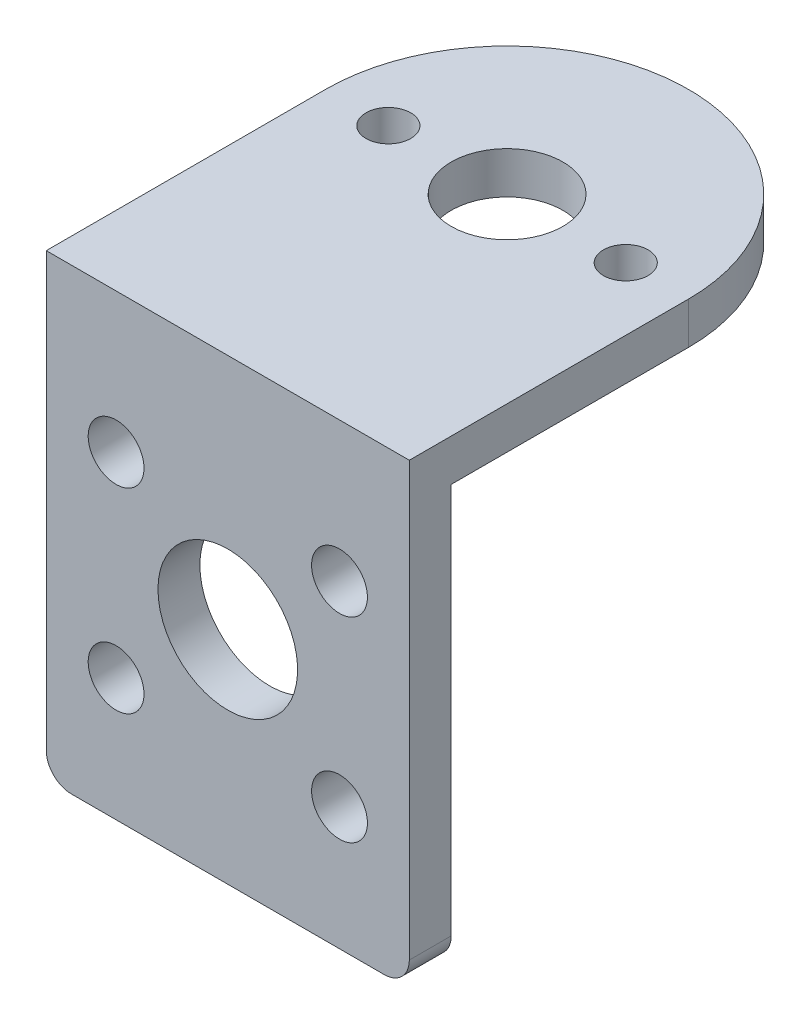
ISO-10303-21;
HEADER;
FILE_DESCRIPTION(('STEP AP214'),'2;1');
FILE_NAME('part.step','',(''),(''),'','','');
FILE_SCHEMA(('AUTOMOTIVE_DESIGN { 1 0 10303 214 1 1 1 1 }'));
ENDSEC;
DATA;
#1=APPLICATION_CONTEXT('core data for automotive mechanical design processes');
#2=APPLICATION_PROTOCOL_DEFINITION('international standard','automotive_design',2000,#1);
#3=PRODUCT_CONTEXT('',#1,'mechanical');
#4=PRODUCT('Part','Part','',(#3));
#5=PRODUCT_RELATED_PRODUCT_CATEGORY('part','',(#4));
#6=PRODUCT_DEFINITION_FORMATION('','',#4);
#7=PRODUCT_DEFINITION_CONTEXT('part definition',#1,'design');
#8=PRODUCT_DEFINITION('design','',#6,#7);
#9=PRODUCT_DEFINITION_SHAPE('','',#8);
#10=(LENGTH_UNIT() NAMED_UNIT(*) SI_UNIT(.MILLI.,.METRE.));
#11=(NAMED_UNIT(*) PLANE_ANGLE_UNIT() SI_UNIT($,.RADIAN.));
#12=(NAMED_UNIT(*) SI_UNIT($,.STERADIAN.) SOLID_ANGLE_UNIT());
#13=UNCERTAINTY_MEASURE_WITH_UNIT(LENGTH_MEASURE(1.E-05),#10,'distance_accuracy_value','');
#14=(GEOMETRIC_REPRESENTATION_CONTEXT(3) GLOBAL_UNCERTAINTY_ASSIGNED_CONTEXT((#13)) GLOBAL_UNIT_ASSIGNED_CONTEXT((#10,
#11,#12)) REPRESENTATION_CONTEXT('',''));
#15=CARTESIAN_POINT('',(0.,0.,0.));
#16=DIRECTION('',(0.,0.,1.));
#17=DIRECTION('',(1.,0.,0.));
#18=AXIS2_PLACEMENT_3D('',#15,#16,#17);
#19=CARTESIAN_POINT('',(0.,3.,20.));
#20=DIRECTION('',(0.,0.,1.));
#21=DIRECTION('',(1.,0.,0.));
#22=AXIS2_PLACEMENT_3D('',#19,#20,#21);
#23=PLANE('',#22);
#24=CARTESIAN_POINT('',(8.,-21.,20.));
#25=DIRECTION('',(0.,0.,1.));
#26=DIRECTION('',(1.,0.,0.));
#27=AXIS2_PLACEMENT_3D('',#24,#25,#26);
#28=CIRCLE('',#27,2.);
#29=CARTESIAN_POINT('',(10.,-21.,20.));
#30=VERTEX_POINT('',#29);
#31=EDGE_CURVE('E141',#30,#30,#28,.T.);
#32=ORIENTED_EDGE('',*,*,#31,.F.);
#33=EDGE_LOOP('',(#32));
#34=FACE_BOUND('',#33,.T.);
#35=CARTESIAN_POINT('',(8.,-7.,20.));
#36=DIRECTION('',(0.,0.,1.));
#37=DIRECTION('',(1.,0.,0.));
#38=AXIS2_PLACEMENT_3D('',#35,#36,#37);
#39=CIRCLE('',#38,2.);
#40=CARTESIAN_POINT('',(10.,-7.,20.));
#41=VERTEX_POINT('',#40);
#42=EDGE_CURVE('E167',#41,#41,#39,.T.);
#43=ORIENTED_EDGE('',*,*,#42,.F.);
#44=EDGE_LOOP('',(#43));
#45=FACE_BOUND('',#44,.T.);
#46=DIRECTION('',(0.,-1.,0.));
#47=VECTOR('',#46,1.);
#48=CARTESIAN_POINT('',(-13.,3.,20.));
#49=LINE('',#48,#47);
#50=CARTESIAN_POINT('',(-13.,3.,20.));
#51=VERTEX_POINT('',#50);
#52=CARTESIAN_POINT('',(-13.,-28.,20.));
#53=VERTEX_POINT('',#52);
#54=EDGE_CURVE('E215',#51,#53,#49,.T.);
#55=ORIENTED_EDGE('',*,*,#54,.T.);
#56=CARTESIAN_POINT('',(-11.2,-28.,20.));
#57=DIRECTION('',(0.,0.,-1.));
#58=DIRECTION('',(-1.,0.,0.));
#59=AXIS2_PLACEMENT_3D('',#56,#57,#58);
#60=CIRCLE('',#59,1.8);
#61=CARTESIAN_POINT('',(-11.2,-29.8,20.));
#62=VERTEX_POINT('',#61);
#63=EDGE_CURVE('E127',#53,#62,#60,.F.);
#64=ORIENTED_EDGE('',*,*,#63,.T.);
#65=DIRECTION('',(-1.,0.,0.));
#66=VECTOR('',#65,1.);
#67=CARTESIAN_POINT('',(0.,-29.8,20.));
#68=LINE('',#67,#66);
#69=CARTESIAN_POINT('',(11.2,-29.8,20.));
#70=VERTEX_POINT('',#69);
#71=EDGE_CURVE('E114',#70,#62,#68,.T.);
#72=ORIENTED_EDGE('',*,*,#71,.F.);
#73=CARTESIAN_POINT('',(11.2,-28.,20.));
#74=DIRECTION('',(0.,0.,-1.));
#75=DIRECTION('',(-1.,0.,0.));
#76=AXIS2_PLACEMENT_3D('',#73,#74,#75);
#77=CIRCLE('',#76,1.8);
#78=CARTESIAN_POINT('',(13.,-28.,20.));
#79=VERTEX_POINT('',#78);
#80=EDGE_CURVE('E123',#79,#70,#77,.T.);
#81=ORIENTED_EDGE('',*,*,#80,.F.);
#82=DIRECTION('',(0.,-1.,0.));
#83=VECTOR('',#82,1.);
#84=CARTESIAN_POINT('',(13.,3.,20.));
#85=LINE('',#84,#83);
#86=CARTESIAN_POINT('',(13.,3.,20.));
#87=VERTEX_POINT('',#86);
#88=EDGE_CURVE('E60',#87,#79,#85,.T.);
#89=ORIENTED_EDGE('',*,*,#88,.F.);
#90=DIRECTION('',(-1.,0.,0.));
#91=VECTOR('',#90,1.);
#92=CARTESIAN_POINT('',(0.,3.,20.));
#93=LINE('',#92,#91);
#94=EDGE_CURVE('E189',#87,#51,#93,.T.);
#95=ORIENTED_EDGE('',*,*,#94,.T.);
#96=EDGE_LOOP('',(#55,#64,#72,#81,#89,#95));
#97=FACE_BOUND('',#96,.T.);
#98=CARTESIAN_POINT('',(-8.,-21.,20.));
#99=DIRECTION('',(0.,0.,-1.));
#100=DIRECTION('',(-1.,0.,0.));
#101=AXIS2_PLACEMENT_3D('',#98,#99,#100);
#102=CIRCLE('',#101,2.);
#103=CARTESIAN_POINT('',(-10.,-21.,20.));
#104=VERTEX_POINT('',#103);
#105=EDGE_CURVE('E147',#104,#104,#102,.T.);
#106=ORIENTED_EDGE('',*,*,#105,.T.);
#107=EDGE_LOOP('',(#106));
#108=FACE_BOUND('',#107,.T.);
#109=CARTESIAN_POINT('',(-8.,-7.,20.));
#110=DIRECTION('',(0.,0.,-1.));
#111=DIRECTION('',(-1.,0.,0.));
#112=AXIS2_PLACEMENT_3D('',#109,#110,#111);
#113=CIRCLE('',#112,2.);
#114=CARTESIAN_POINT('',(-10.,-7.,20.));
#115=VERTEX_POINT('',#114);
#116=EDGE_CURVE('E146',#115,#115,#113,.T.);
#117=ORIENTED_EDGE('',*,*,#116,.T.);
#118=EDGE_LOOP('',(#117));
#119=FACE_BOUND('',#118,.T.);
#120=CARTESIAN_POINT('',(0.,-14.,20.));
#121=DIRECTION('',(0.,0.,-1.));
#122=DIRECTION('',(-1.,0.,0.));
#123=AXIS2_PLACEMENT_3D('',#120,#121,#122);
#124=CIRCLE('',#123,5.);
#125=CARTESIAN_POINT('',(-5.,-14.,20.));
#126=VERTEX_POINT('',#125);
#127=EDGE_CURVE('E159',#126,#126,#124,.T.);
#128=ORIENTED_EDGE('',*,*,#127,.T.);
#129=EDGE_LOOP('',(#128));
#130=FACE_BOUND('',#129,.T.);
#131=ADVANCED_FACE('F36',(#34,#45,#97,#108,#119,#130),#23,.T.);
#132=CARTESIAN_POINT('',(13.,-28.,17.));
#133=DIRECTION('',(0.,0.,-1.));
#134=DIRECTION('',(-1.,0.,0.));
#135=AXIS2_PLACEMENT_3D('',#132,#133,#134);
#136=PLANE('',#135);
#137=CARTESIAN_POINT('',(8.,-21.,17.));
#138=DIRECTION('',(0.,0.,1.));
#139=DIRECTION('',(1.,0.,0.));
#140=AXIS2_PLACEMENT_3D('',#137,#138,#139);
#141=CIRCLE('',#140,2.);
#142=CARTESIAN_POINT('',(10.,-21.,17.));
#143=VERTEX_POINT('',#142);
#144=EDGE_CURVE('E150',#143,#143,#141,.T.);
#145=ORIENTED_EDGE('',*,*,#144,.T.);
#146=EDGE_LOOP('',(#145));
#147=FACE_BOUND('',#146,.T.);
#148=CARTESIAN_POINT('',(8.,-7.,17.));
#149=DIRECTION('',(0.,0.,1.));
#150=DIRECTION('',(1.,0.,0.));
#151=AXIS2_PLACEMENT_3D('',#148,#149,#150);
#152=CIRCLE('',#151,2.);
#153=CARTESIAN_POINT('',(10.,-7.,17.));
#154=VERTEX_POINT('',#153);
#155=EDGE_CURVE('E158',#154,#154,#152,.T.);
#156=ORIENTED_EDGE('',*,*,#155,.T.);
#157=EDGE_LOOP('',(#156));
#158=FACE_BOUND('',#157,.T.);
#159=DIRECTION('',(-1.,0.,0.));
#160=VECTOR('',#159,1.);
#161=CARTESIAN_POINT('',(13.,0.,17.));
#162=LINE('',#161,#160);
#163=CARTESIAN_POINT('',(13.,0.,17.));
#164=VERTEX_POINT('',#163);
#165=CARTESIAN_POINT('',(-13.,0.,17.));
#166=VERTEX_POINT('',#165);
#167=EDGE_CURVE('E170',#164,#166,#162,.T.);
#168=ORIENTED_EDGE('',*,*,#167,.F.);
#169=DIRECTION('',(0.,1.,0.));
#170=VECTOR('',#169,1.);
#171=CARTESIAN_POINT('',(13.,-28.,17.));
#172=LINE('',#171,#170);
#173=CARTESIAN_POINT('',(13.,-28.,17.));
#174=VERTEX_POINT('',#173);
#175=EDGE_CURVE('E178',#174,#164,#172,.T.);
#176=ORIENTED_EDGE('',*,*,#175,.F.);
#177=CARTESIAN_POINT('',(11.2,-28.,17.));
#178=DIRECTION('',(0.,0.,-1.));
#179=DIRECTION('',(-1.,0.,0.));
#180=AXIS2_PLACEMENT_3D('',#177,#178,#179);
#181=CIRCLE('',#180,1.8);
#182=CARTESIAN_POINT('',(11.2,-29.8,17.));
#183=VERTEX_POINT('',#182);
#184=EDGE_CURVE('E138',#174,#183,#181,.T.);
#185=ORIENTED_EDGE('',*,*,#184,.T.);
#186=DIRECTION('',(-1.,0.,0.));
#187=VECTOR('',#186,1.);
#188=CARTESIAN_POINT('',(0.,-29.8,17.));
#189=LINE('',#188,#187);
#190=CARTESIAN_POINT('',(-11.2,-29.8,17.));
#191=VERTEX_POINT('',#190);
#192=EDGE_CURVE('E116',#183,#191,#189,.T.);
#193=ORIENTED_EDGE('',*,*,#192,.T.);
#194=CARTESIAN_POINT('',(-11.2,-28.,17.));
#195=DIRECTION('',(0.,0.,-1.));
#196=DIRECTION('',(-1.,0.,0.));
#197=AXIS2_PLACEMENT_3D('',#194,#195,#196);
#198=CIRCLE('',#197,1.8);
#199=CARTESIAN_POINT('',(-13.,-28.,17.));
#200=VERTEX_POINT('',#199);
#201=EDGE_CURVE('E135',#200,#191,#198,.F.);
#202=ORIENTED_EDGE('',*,*,#201,.F.);
#203=DIRECTION('',(0.,1.,0.));
#204=VECTOR('',#203,1.);
#205=CARTESIAN_POINT('',(-13.,-28.,17.));
#206=LINE('',#205,#204);
#207=EDGE_CURVE('E51',#200,#166,#206,.T.);
#208=ORIENTED_EDGE('',*,*,#207,.T.);
#209=EDGE_LOOP('',(#168,#176,#185,#193,#202,#208));
#210=FACE_BOUND('',#209,.T.);
#211=CARTESIAN_POINT('',(-8.,-21.,17.));
#212=DIRECTION('',(0.,0.,-1.));
#213=DIRECTION('',(-1.,0.,0.));
#214=AXIS2_PLACEMENT_3D('',#211,#212,#213);
#215=CIRCLE('',#214,2.);
#216=CARTESIAN_POINT('',(-10.,-21.,17.));
#217=VERTEX_POINT('',#216);
#218=EDGE_CURVE('E143',#217,#217,#215,.T.);
#219=ORIENTED_EDGE('',*,*,#218,.F.);
#220=EDGE_LOOP('',(#219));
#221=FACE_BOUND('',#220,.T.);
#222=CARTESIAN_POINT('',(-8.,-7.,17.));
#223=DIRECTION('',(0.,0.,-1.));
#224=DIRECTION('',(-1.,0.,0.));
#225=AXIS2_PLACEMENT_3D('',#222,#223,#224);
#226=CIRCLE('',#225,2.);
#227=CARTESIAN_POINT('',(-10.,-7.,17.));
#228=VERTEX_POINT('',#227);
#229=EDGE_CURVE('E162',#228,#228,#226,.T.);
#230=ORIENTED_EDGE('',*,*,#229,.F.);
#231=EDGE_LOOP('',(#230));
#232=FACE_BOUND('',#231,.T.);
#233=CARTESIAN_POINT('',(0.,-14.,17.));
#234=DIRECTION('',(0.,0.,-1.));
#235=DIRECTION('',(-1.,0.,0.));
#236=AXIS2_PLACEMENT_3D('',#233,#234,#235);
#237=CIRCLE('',#236,5.);
#238=CARTESIAN_POINT('',(-5.,-14.,17.));
#239=VERTEX_POINT('',#238);
#240=EDGE_CURVE('E155',#239,#239,#237,.T.);
#241=ORIENTED_EDGE('',*,*,#240,.F.);
#242=EDGE_LOOP('',(#241));
#243=FACE_BOUND('',#242,.T.);
#244=ADVANCED_FACE('F224',(#147,#158,#210,#221,#232,#243),#136,.T.);
#245=CARTESIAN_POINT('',(13.,3.,0.));
#246=DIRECTION('',(1.,0.,0.));
#247=DIRECTION('',(0.,0.,-1.));
#248=AXIS2_PLACEMENT_3D('',#245,#246,#247);
#249=PLANE('',#248);
#250=DIRECTION('',(0.,0.,1.));
#251=VECTOR('',#250,1.);
#252=CARTESIAN_POINT('',(13.,0.,0.));
#253=LINE('',#252,#251);
#254=CARTESIAN_POINT('',(13.,0.,0.));
#255=VERTEX_POINT('',#254);
#256=EDGE_CURVE('E180',#255,#164,#253,.T.);
#257=ORIENTED_EDGE('',*,*,#256,.F.);
#258=DIRECTION('',(0.,-1.,0.));
#259=VECTOR('',#258,1.);
#260=CARTESIAN_POINT('',(13.,3.,0.));
#261=LINE('',#260,#259);
#262=CARTESIAN_POINT('',(13.,3.,0.));
#263=VERTEX_POINT('',#262);
#264=EDGE_CURVE('E11',#263,#255,#261,.T.);
#265=ORIENTED_EDGE('',*,*,#264,.F.);
#266=DIRECTION('',(0.,0.,1.));
#267=VECTOR('',#266,1.);
#268=CARTESIAN_POINT('',(13.,3.,0.));
#269=LINE('',#268,#267);
#270=EDGE_CURVE('E182',#263,#87,#269,.T.);
#271=ORIENTED_EDGE('',*,*,#270,.T.);
#272=ORIENTED_EDGE('',*,*,#88,.T.);
#273=DIRECTION('',(0.,0.,-1.));
#274=VECTOR('',#273,1.);
#275=CARTESIAN_POINT('',(13.,-28.,20.));
#276=LINE('',#275,#274);
#277=EDGE_CURVE('E126',#79,#174,#276,.T.);
#278=ORIENTED_EDGE('',*,*,#277,.T.);
#279=ORIENTED_EDGE('',*,*,#175,.T.);
#280=EDGE_LOOP('',(#257,#265,#271,#272,#278,#279));
#281=FACE_BOUND('',#280,.T.);
#282=ADVANCED_FACE('F38',(#281),#249,.T.);
#283=CARTESIAN_POINT('',(0.,3.,0.));
#284=DIRECTION('',(0.,-1.,0.));
#285=DIRECTION('',(0.,0.,-1.));
#286=AXIS2_PLACEMENT_3D('',#283,#284,#285);
#287=CYLINDRICAL_SURFACE('',#286,13.);
#288=CARTESIAN_POINT('',(0.,0.,0.));
#289=DIRECTION('',(0.,1.,0.));
#290=DIRECTION('',(0.,0.,1.));
#291=AXIS2_PLACEMENT_3D('',#288,#289,#290);
#292=CIRCLE('',#291,13.);
#293=CARTESIAN_POINT('',(-13.,0.,0.));
#294=VERTEX_POINT('',#293);
#295=EDGE_CURVE('E75',#255,#294,#292,.T.);
#296=ORIENTED_EDGE('',*,*,#295,.T.);
#297=DIRECTION('',(0.,-1.,0.));
#298=VECTOR('',#297,1.);
#299=CARTESIAN_POINT('',(-13.,3.,0.));
#300=LINE('',#299,#298);
#301=CARTESIAN_POINT('',(-13.,3.,0.));
#302=VERTEX_POINT('',#301);
#303=EDGE_CURVE('E44',#302,#294,#300,.T.);
#304=ORIENTED_EDGE('',*,*,#303,.F.);
#305=CARTESIAN_POINT('',(0.,3.,0.));
#306=DIRECTION('',(0.,1.,0.));
#307=DIRECTION('',(0.,0.,1.));
#308=AXIS2_PLACEMENT_3D('',#305,#306,#307);
#309=CIRCLE('',#308,13.);
#310=EDGE_CURVE('E184',#263,#302,#309,.T.);
#311=ORIENTED_EDGE('',*,*,#310,.F.);
#312=ORIENTED_EDGE('',*,*,#264,.T.);
#313=EDGE_LOOP('',(#296,#304,#311,#312));
#314=FACE_BOUND('',#313,.T.);
#315=ADVANCED_FACE('F263',(#314),#287,.T.);
#316=CARTESIAN_POINT('',(-13.,3.,0.));
#317=DIRECTION('',(1.,0.,0.));
#318=DIRECTION('',(0.,0.,-1.));
#319=AXIS2_PLACEMENT_3D('',#316,#317,#318);
#320=PLANE('',#319);
#321=DIRECTION('',(0.,0.,1.));
#322=VECTOR('',#321,1.);
#323=CARTESIAN_POINT('',(-13.,0.,0.));
#324=LINE('',#323,#322);
#325=EDGE_CURVE('E203',#294,#166,#324,.T.);
#326=ORIENTED_EDGE('',*,*,#325,.T.);
#327=ORIENTED_EDGE('',*,*,#207,.F.);
#328=DIRECTION('',(0.,0.,-1.));
#329=VECTOR('',#328,1.);
#330=CARTESIAN_POINT('',(-13.,-28.,20.));
#331=LINE('',#330,#329);
#332=EDGE_CURVE('E173',#53,#200,#331,.T.);
#333=ORIENTED_EDGE('',*,*,#332,.F.);
#334=ORIENTED_EDGE('',*,*,#54,.F.);
#335=DIRECTION('',(0.,0.,1.));
#336=VECTOR('',#335,1.);
#337=CARTESIAN_POINT('',(-13.,3.,0.));
#338=LINE('',#337,#336);
#339=EDGE_CURVE('E187',#302,#51,#338,.T.);
#340=ORIENTED_EDGE('',*,*,#339,.F.);
#341=ORIENTED_EDGE('',*,*,#303,.T.);
#342=EDGE_LOOP('',(#326,#327,#333,#334,#340,#341));
#343=FACE_BOUND('',#342,.T.);
#344=ADVANCED_FACE('F219',(#343),#320,.F.);
#345=CARTESIAN_POINT('',(-8.5,3.,0.));
#346=DIRECTION('',(0.,-1.,0.));
#347=DIRECTION('',(0.,0.,-1.));
#348=AXIS2_PLACEMENT_3D('',#345,#346,#347);
#349=CYLINDRICAL_SURFACE('',#348,1.6);
#350=CARTESIAN_POINT('',(-8.5,3.,0.));
#351=DIRECTION('',(0.,1.,0.));
#352=DIRECTION('',(0.,0.,1.));
#353=AXIS2_PLACEMENT_3D('',#350,#351,#352);
#354=CIRCLE('',#353,1.6);
#355=CARTESIAN_POINT('',(-8.5,3.,1.6));
#356=VERTEX_POINT('',#355);
#357=EDGE_CURVE('E194',#356,#356,#354,.T.);
#358=ORIENTED_EDGE('',*,*,#357,.T.);
#359=EDGE_LOOP('',(#358));
#360=FACE_BOUND('',#359,.T.);
#361=CARTESIAN_POINT('',(-8.5,0.,0.));
#362=DIRECTION('',(0.,1.,0.));
#363=DIRECTION('',(0.,0.,1.));
#364=AXIS2_PLACEMENT_3D('',#361,#362,#363);
#365=CIRCLE('',#364,1.6);
#366=CARTESIAN_POINT('',(-8.5,0.,1.6));
#367=VERTEX_POINT('',#366);
#368=EDGE_CURVE('E209',#367,#367,#365,.T.);
#369=ORIENTED_EDGE('',*,*,#368,.F.);
#370=EDGE_LOOP('',(#369));
#371=FACE_BOUND('',#370,.T.);
#372=ADVANCED_FACE('F262',(#360,#371),#349,.F.);
#373=CARTESIAN_POINT('',(0.,3.,0.));
#374=DIRECTION('',(0.,-1.,0.));
#375=DIRECTION('',(0.,0.,-1.));
#376=AXIS2_PLACEMENT_3D('',#373,#374,#375);
#377=CYLINDRICAL_SURFACE('',#376,4.);
#378=CARTESIAN_POINT('',(0.,3.,0.));
#379=DIRECTION('',(0.,1.,0.));
#380=DIRECTION('',(0.,0.,1.));
#381=AXIS2_PLACEMENT_3D('',#378,#379,#380);
#382=CIRCLE('',#381,4.);
#383=CARTESIAN_POINT('',(0.,3.,4.));
#384=VERTEX_POINT('',#383);
#385=EDGE_CURVE('E191',#384,#384,#382,.T.);
#386=ORIENTED_EDGE('',*,*,#385,.T.);
#387=EDGE_LOOP('',(#386));
#388=FACE_BOUND('',#387,.T.);
#389=CARTESIAN_POINT('',(0.,0.,0.));
#390=DIRECTION('',(0.,1.,0.));
#391=DIRECTION('',(0.,0.,1.));
#392=AXIS2_PLACEMENT_3D('',#389,#390,#391);
#393=CIRCLE('',#392,4.);
#394=CARTESIAN_POINT('',(0.,0.,4.));
#395=VERTEX_POINT('',#394);
#396=EDGE_CURVE('E206',#395,#395,#393,.T.);
#397=ORIENTED_EDGE('',*,*,#396,.F.);
#398=EDGE_LOOP('',(#397));
#399=FACE_BOUND('',#398,.T.);
#400=ADVANCED_FACE('F259',(#388,#399),#377,.F.);
#401=CARTESIAN_POINT('',(8.5,3.,0.));
#402=DIRECTION('',(0.,-1.,0.));
#403=DIRECTION('',(0.,0.,-1.));
#404=AXIS2_PLACEMENT_3D('',#401,#402,#403);
#405=CYLINDRICAL_SURFACE('',#404,1.6);
#406=CARTESIAN_POINT('',(8.5,3.,0.));
#407=DIRECTION('',(0.,1.,0.));
#408=DIRECTION('',(0.,0.,1.));
#409=AXIS2_PLACEMENT_3D('',#406,#407,#408);
#410=CIRCLE('',#409,1.6);
#411=CARTESIAN_POINT('',(8.5,3.,1.6));
#412=VERTEX_POINT('',#411);
#413=EDGE_CURVE('E197',#412,#412,#410,.T.);
#414=ORIENTED_EDGE('',*,*,#413,.T.);
#415=EDGE_LOOP('',(#414));
#416=FACE_BOUND('',#415,.T.);
#417=CARTESIAN_POINT('',(8.5,0.,0.));
#418=DIRECTION('',(0.,1.,0.));
#419=DIRECTION('',(0.,0.,1.));
#420=AXIS2_PLACEMENT_3D('',#417,#418,#419);
#421=CIRCLE('',#420,1.6);
#422=CARTESIAN_POINT('',(8.5,0.,1.6));
#423=VERTEX_POINT('',#422);
#424=EDGE_CURVE('E185',#423,#423,#421,.T.);
#425=ORIENTED_EDGE('',*,*,#424,.F.);
#426=EDGE_LOOP('',(#425));
#427=FACE_BOUND('',#426,.T.);
#428=ADVANCED_FACE('F344',(#416,#427),#405,.F.);
#429=CARTESIAN_POINT('',(0.,3.,0.));
#430=DIRECTION('',(0.,1.,0.));
#431=DIRECTION('',(0.,0.,1.));
#432=AXIS2_PLACEMENT_3D('',#429,#430,#431);
#433=PLANE('',#432);
#434=ORIENTED_EDGE('',*,*,#270,.F.);
#435=ORIENTED_EDGE('',*,*,#310,.T.);
#436=ORIENTED_EDGE('',*,*,#339,.T.);
#437=ORIENTED_EDGE('',*,*,#94,.F.);
#438=EDGE_LOOP('',(#434,#435,#436,#437));
#439=FACE_BOUND('',#438,.T.);
#440=ORIENTED_EDGE('',*,*,#385,.F.);
#441=EDGE_LOOP('',(#440));
#442=FACE_BOUND('',#441,.T.);
#443=ORIENTED_EDGE('',*,*,#357,.F.);
#444=EDGE_LOOP('',(#443));
#445=FACE_BOUND('',#444,.T.);
#446=ORIENTED_EDGE('',*,*,#413,.F.);
#447=EDGE_LOOP('',(#446));
#448=FACE_BOUND('',#447,.T.);
#449=ADVANCED_FACE('F229',(#439,#442,#445,#448),#433,.T.);
#450=CARTESIAN_POINT('',(0.,0.,0.));
#451=DIRECTION('',(0.,1.,0.));
#452=DIRECTION('',(0.,0.,1.));
#453=AXIS2_PLACEMENT_3D('',#450,#451,#452);
#454=PLANE('',#453);
#455=ORIENTED_EDGE('',*,*,#256,.T.);
#456=ORIENTED_EDGE('',*,*,#167,.T.);
#457=ORIENTED_EDGE('',*,*,#325,.F.);
#458=ORIENTED_EDGE('',*,*,#295,.F.);
#459=EDGE_LOOP('',(#455,#456,#457,#458));
#460=FACE_BOUND('',#459,.T.);
#461=ORIENTED_EDGE('',*,*,#396,.T.);
#462=EDGE_LOOP('',(#461));
#463=FACE_BOUND('',#462,.T.);
#464=ORIENTED_EDGE('',*,*,#368,.T.);
#465=EDGE_LOOP('',(#464));
#466=FACE_BOUND('',#465,.T.);
#467=ORIENTED_EDGE('',*,*,#424,.T.);
#468=EDGE_LOOP('',(#467));
#469=FACE_BOUND('',#468,.T.);
#470=ADVANCED_FACE('F222',(#460,#463,#466,#469),#454,.F.);
#471=CARTESIAN_POINT('',(8.,-7.,20.));
#472=DIRECTION('',(0.,0.,-1.));
#473=DIRECTION('',(-1.,0.,0.));
#474=AXIS2_PLACEMENT_3D('',#471,#472,#473);
#475=CYLINDRICAL_SURFACE('',#474,2.);
#476=ORIENTED_EDGE('',*,*,#42,.T.);
#477=EDGE_LOOP('',(#476));
#478=FACE_BOUND('',#477,.T.);
#479=ORIENTED_EDGE('',*,*,#155,.F.);
#480=EDGE_LOOP('',(#479));
#481=FACE_BOUND('',#480,.T.);
#482=ADVANCED_FACE('F316',(#478,#481),#475,.F.);
#483=CARTESIAN_POINT('',(8.,-21.,20.));
#484=DIRECTION('',(0.,0.,-1.));
#485=DIRECTION('',(-1.,0.,0.));
#486=AXIS2_PLACEMENT_3D('',#483,#484,#485);
#487=CYLINDRICAL_SURFACE('',#486,2.);
#488=ORIENTED_EDGE('',*,*,#31,.T.);
#489=EDGE_LOOP('',(#488));
#490=FACE_BOUND('',#489,.T.);
#491=ORIENTED_EDGE('',*,*,#144,.F.);
#492=EDGE_LOOP('',(#491));
#493=FACE_BOUND('',#492,.T.);
#494=ADVANCED_FACE('F307',(#490,#493),#487,.F.);
#495=CARTESIAN_POINT('',(-8.,-21.,20.));
#496=DIRECTION('',(0.,0.,-1.));
#497=DIRECTION('',(-1.,0.,0.));
#498=AXIS2_PLACEMENT_3D('',#495,#496,#497);
#499=CYLINDRICAL_SURFACE('',#498,2.);
#500=ORIENTED_EDGE('',*,*,#105,.F.);
#501=EDGE_LOOP('',(#500));
#502=FACE_BOUND('',#501,.T.);
#503=ORIENTED_EDGE('',*,*,#218,.T.);
#504=EDGE_LOOP('',(#503));
#505=FACE_BOUND('',#504,.T.);
#506=ADVANCED_FACE('F297',(#502,#505),#499,.F.);
#507=CARTESIAN_POINT('',(-8.,-7.,20.));
#508=DIRECTION('',(0.,0.,-1.));
#509=DIRECTION('',(-1.,0.,0.));
#510=AXIS2_PLACEMENT_3D('',#507,#508,#509);
#511=CYLINDRICAL_SURFACE('',#510,2.);
#512=ORIENTED_EDGE('',*,*,#116,.F.);
#513=EDGE_LOOP('',(#512));
#514=FACE_BOUND('',#513,.T.);
#515=ORIENTED_EDGE('',*,*,#229,.T.);
#516=EDGE_LOOP('',(#515));
#517=FACE_BOUND('',#516,.T.);
#518=ADVANCED_FACE('F242',(#514,#517),#511,.F.);
#519=CARTESIAN_POINT('',(0.,-14.,20.));
#520=DIRECTION('',(0.,0.,-1.));
#521=DIRECTION('',(-1.,0.,0.));
#522=AXIS2_PLACEMENT_3D('',#519,#520,#521);
#523=CYLINDRICAL_SURFACE('',#522,5.);
#524=ORIENTED_EDGE('',*,*,#127,.F.);
#525=EDGE_LOOP('',(#524));
#526=FACE_BOUND('',#525,.T.);
#527=ORIENTED_EDGE('',*,*,#240,.T.);
#528=EDGE_LOOP('',(#527));
#529=FACE_BOUND('',#528,.T.);
#530=ADVANCED_FACE('F235',(#526,#529),#523,.F.);
#531=CARTESIAN_POINT('',(-11.2,-28.,20.));
#532=DIRECTION('',(0.,0.,-1.));
#533=DIRECTION('',(-1.,0.,0.));
#534=AXIS2_PLACEMENT_3D('',#531,#532,#533);
#535=CYLINDRICAL_SURFACE('',#534,1.8);
#536=ORIENTED_EDGE('',*,*,#201,.T.);
#537=DIRECTION('',(0.,0.,-1.));
#538=VECTOR('',#537,1.);
#539=CARTESIAN_POINT('',(-11.2,-29.8,20.));
#540=LINE('',#539,#538);
#541=EDGE_CURVE('E120',#62,#191,#540,.T.);
#542=ORIENTED_EDGE('',*,*,#541,.F.);
#543=ORIENTED_EDGE('',*,*,#63,.F.);
#544=ORIENTED_EDGE('',*,*,#332,.T.);
#545=EDGE_LOOP('',(#536,#542,#543,#544));
#546=FACE_BOUND('',#545,.T.);
#547=ADVANCED_FACE('F233',(#546),#535,.T.);
#548=CARTESIAN_POINT('',(0.,-29.8,20.));
#549=DIRECTION('',(0.,-1.,0.));
#550=DIRECTION('',(0.,0.,-1.));
#551=AXIS2_PLACEMENT_3D('',#548,#549,#550);
#552=PLANE('',#551);
#553=ORIENTED_EDGE('',*,*,#192,.F.);
#554=DIRECTION('',(0.,0.,-1.));
#555=VECTOR('',#554,1.);
#556=CARTESIAN_POINT('',(11.2,-29.8,20.));
#557=LINE('',#556,#555);
#558=EDGE_CURVE('E110',#70,#183,#557,.T.);
#559=ORIENTED_EDGE('',*,*,#558,.F.);
#560=ORIENTED_EDGE('',*,*,#71,.T.);
#561=ORIENTED_EDGE('',*,*,#541,.T.);
#562=EDGE_LOOP('',(#553,#559,#560,#561));
#563=FACE_BOUND('',#562,.T.);
#564=ADVANCED_FACE('F112',(#563),#552,.T.);
#565=CARTESIAN_POINT('',(11.2,-28.,20.));
#566=DIRECTION('',(0.,0.,-1.));
#567=DIRECTION('',(-1.,0.,0.));
#568=AXIS2_PLACEMENT_3D('',#565,#566,#567);
#569=CYLINDRICAL_SURFACE('',#568,1.8);
#570=ORIENTED_EDGE('',*,*,#184,.F.);
#571=ORIENTED_EDGE('',*,*,#277,.F.);
#572=ORIENTED_EDGE('',*,*,#80,.T.);
#573=ORIENTED_EDGE('',*,*,#558,.T.);
#574=EDGE_LOOP('',(#570,#571,#572,#573));
#575=FACE_BOUND('',#574,.T.);
#576=ADVANCED_FACE('F124',(#575),#569,.T.);
#577=CLOSED_SHELL('',(#131,#244,#282,#315,#344,#372,#400,#428,#449,#470,#482,#494,#506,#518,
#530,#547,#564,#576));
#578=MANIFOLD_SOLID_BREP('B2',#577);
#579=ADVANCED_BREP_SHAPE_REPRESENTATION('',(#18,#578),#14);
#580=SHAPE_DEFINITION_REPRESENTATION(#9,#579);
ENDSEC;
END-ISO-10303-21;
